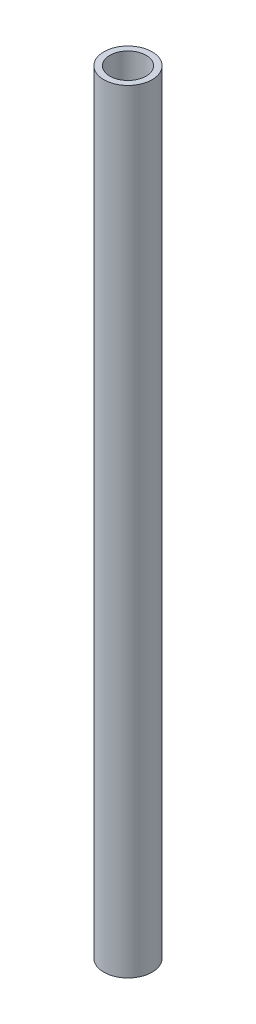
ISO-10303-21;
HEADER;
FILE_DESCRIPTION(('STEP AP214'),'2;1');
FILE_NAME('part.step','',(''),(''),'','','');
FILE_SCHEMA(('AUTOMOTIVE_DESIGN { 1 0 10303 214 1 1 1 1 }'));
ENDSEC;
DATA;
#1=APPLICATION_CONTEXT('core data for automotive mechanical design processes');
#2=APPLICATION_PROTOCOL_DEFINITION('international standard','automotive_design',2000,#1);
#3=PRODUCT_CONTEXT('',#1,'mechanical');
#4=PRODUCT('Part','Part','',(#3));
#5=PRODUCT_RELATED_PRODUCT_CATEGORY('part','',(#4));
#6=PRODUCT_DEFINITION_FORMATION('','',#4);
#7=PRODUCT_DEFINITION_CONTEXT('part definition',#1,'design');
#8=PRODUCT_DEFINITION('design','',#6,#7);
#9=PRODUCT_DEFINITION_SHAPE('','',#8);
#10=(LENGTH_UNIT() NAMED_UNIT(*) SI_UNIT(.MILLI.,.METRE.));
#11=(NAMED_UNIT(*) PLANE_ANGLE_UNIT() SI_UNIT($,.RADIAN.));
#12=(NAMED_UNIT(*) SI_UNIT($,.STERADIAN.) SOLID_ANGLE_UNIT());
#13=UNCERTAINTY_MEASURE_WITH_UNIT(LENGTH_MEASURE(1.E-05),#10,'distance_accuracy_value','');
#14=(GEOMETRIC_REPRESENTATION_CONTEXT(3) GLOBAL_UNCERTAINTY_ASSIGNED_CONTEXT((#13)) GLOBAL_UNIT_ASSIGNED_CONTEXT((#10,
#11,#12)) REPRESENTATION_CONTEXT('',''));
#15=CARTESIAN_POINT('',(0.,0.,0.));
#16=DIRECTION('',(0.,0.,1.));
#17=DIRECTION('',(1.,0.,0.));
#18=AXIS2_PLACEMENT_3D('',#15,#16,#17);
#19=CARTESIAN_POINT('',(-391.18166808322,406.4,-212.743279788072));
#20=DIRECTION('',(0.,1.,0.));
#21=DIRECTION('',(0.,0.,1.));
#22=AXIS2_PLACEMENT_3D('',#19,#20,#21);
#23=PLANE('',#22);
#24=CARTESIAN_POINT('',(-391.18166808322,406.4,-212.743279788072));
#25=DIRECTION('',(0.,1.,0.));
#26=DIRECTION('',(0.,0.,1.));
#27=AXIS2_PLACEMENT_3D('',#24,#25,#26);
#28=CIRCLE('',#27,12.7);
#29=CARTESIAN_POINT('',(-391.18166808322,406.4,-200.043279788072));
#30=VERTEX_POINT('',#29);
#31=EDGE_CURVE('E10',#30,#30,#28,.T.);
#32=ORIENTED_EDGE('',*,*,#31,.T.);
#33=EDGE_LOOP('',(#32));
#34=FACE_BOUND('',#33,.T.);
#35=CARTESIAN_POINT('',(-391.18166808322,406.4,-212.743279788072));
#36=DIRECTION('',(0.,1.,0.));
#37=DIRECTION('',(0.,0.,1.));
#38=AXIS2_PLACEMENT_3D('',#35,#36,#37);
#39=CIRCLE('',#38,9.52500000000002);
#40=CARTESIAN_POINT('',(-391.18166808322,406.4,-203.218279788071));
#41=VERTEX_POINT('',#40);
#42=EDGE_CURVE('E46',#41,#41,#39,.T.);
#43=ORIENTED_EDGE('',*,*,#42,.F.);
#44=EDGE_LOOP('',(#43));
#45=FACE_BOUND('',#44,.T.);
#46=ADVANCED_FACE('F35',(#34,#45),#23,.T.);
#47=CARTESIAN_POINT('',(-391.18166808322,0.,-212.743279788072));
#48=DIRECTION('',(0.,1.,0.));
#49=DIRECTION('',(0.,0.,1.));
#50=AXIS2_PLACEMENT_3D('',#47,#48,#49);
#51=PLANE('',#50);
#52=CARTESIAN_POINT('',(-391.18166808322,0.,-212.743279788072));
#53=DIRECTION('',(0.,1.,0.));
#54=DIRECTION('',(0.,0.,1.));
#55=AXIS2_PLACEMENT_3D('',#52,#53,#54);
#56=CIRCLE('',#55,12.7);
#57=CARTESIAN_POINT('',(-391.18166808322,0.,-200.043279788072));
#58=VERTEX_POINT('',#57);
#59=EDGE_CURVE('E39',#58,#58,#56,.T.);
#60=ORIENTED_EDGE('',*,*,#59,.F.);
#61=EDGE_LOOP('',(#60));
#62=FACE_BOUND('',#61,.T.);
#63=CARTESIAN_POINT('',(-391.18166808322,0.,-212.743279788072));
#64=DIRECTION('',(0.,1.,0.));
#65=DIRECTION('',(0.,0.,1.));
#66=AXIS2_PLACEMENT_3D('',#63,#64,#65);
#67=CIRCLE('',#66,9.52500000000002);
#68=CARTESIAN_POINT('',(-391.18166808322,0.,-203.218279788071));
#69=VERTEX_POINT('',#68);
#70=EDGE_CURVE('E48',#69,#69,#67,.T.);
#71=ORIENTED_EDGE('',*,*,#70,.T.);
#72=EDGE_LOOP('',(#71));
#73=FACE_BOUND('',#72,.T.);
#74=ADVANCED_FACE('F58',(#62,#73),#51,.F.);
#75=CARTESIAN_POINT('',(-391.18166808322,406.4,-212.743279788072));
#76=DIRECTION('',(0.,-1.,0.));
#77=DIRECTION('',(0.,0.,-1.));
#78=AXIS2_PLACEMENT_3D('',#75,#76,#77);
#79=CYLINDRICAL_SURFACE('',#78,12.7);
#80=ORIENTED_EDGE('',*,*,#31,.F.);
#81=EDGE_LOOP('',(#80));
#82=FACE_BOUND('',#81,.T.);
#83=ORIENTED_EDGE('',*,*,#59,.T.);
#84=EDGE_LOOP('',(#83));
#85=FACE_BOUND('',#84,.T.);
#86=ADVANCED_FACE('F37',(#82,#85),#79,.T.);
#87=CARTESIAN_POINT('',(-391.18166808322,406.4,-212.743279788072));
#88=DIRECTION('',(0.,-1.,0.));
#89=DIRECTION('',(0.,0.,-1.));
#90=AXIS2_PLACEMENT_3D('',#87,#88,#89);
#91=CYLINDRICAL_SURFACE('',#90,9.52500000000002);
#92=ORIENTED_EDGE('',*,*,#42,.T.);
#93=EDGE_LOOP('',(#92));
#94=FACE_BOUND('',#93,.T.);
#95=ORIENTED_EDGE('',*,*,#70,.F.);
#96=EDGE_LOOP('',(#95));
#97=FACE_BOUND('',#96,.T.);
#98=ADVANCED_FACE('F54',(#94,#97),#91,.F.);
#99=CLOSED_SHELL('',(#46,#74,#86,#98));
#100=MANIFOLD_SOLID_BREP('B2',#99);
#101=ADVANCED_BREP_SHAPE_REPRESENTATION('',(#18,#100),#14);
#102=SHAPE_DEFINITION_REPRESENTATION(#9,#101);
ENDSEC;
END-ISO-10303-21;
